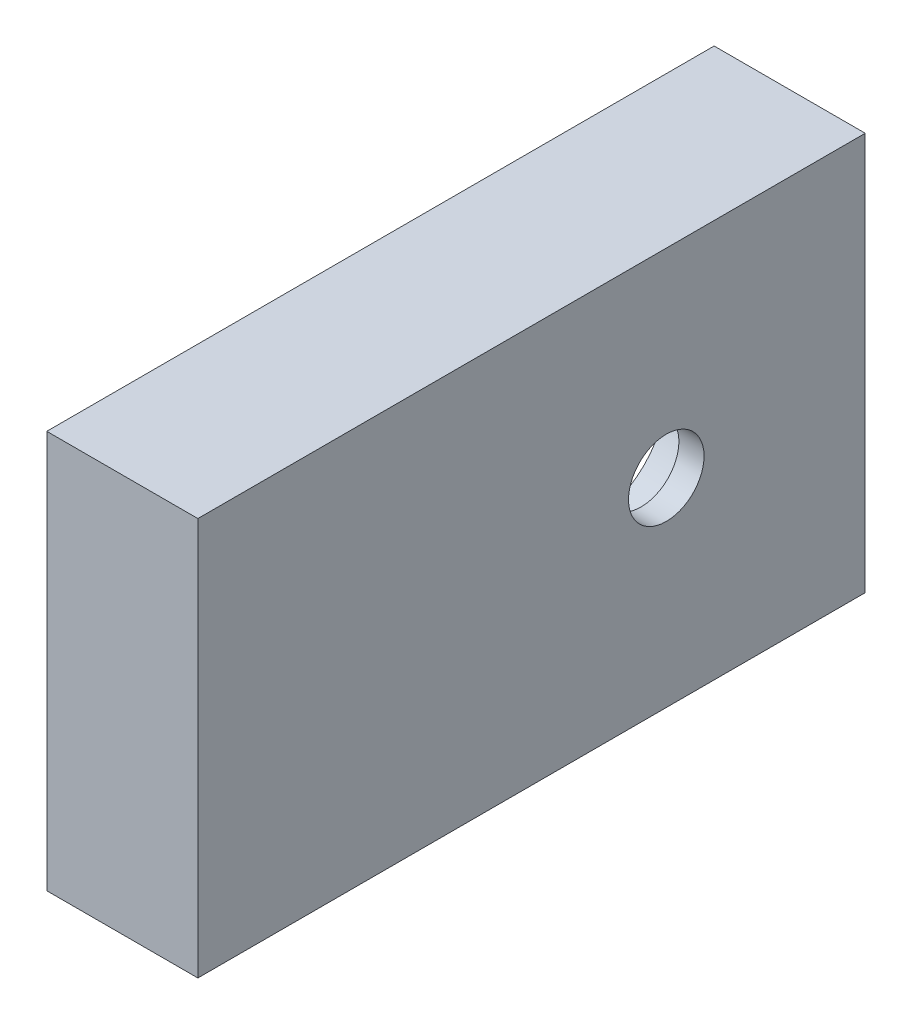
ISO-10303-21;
HEADER;
FILE_DESCRIPTION(('STEP AP214'),'2;1');
FILE_NAME('part.step','',(''),(''),'','','');
FILE_SCHEMA(('AUTOMOTIVE_DESIGN { 1 0 10303 214 1 1 1 1 }'));
ENDSEC;
DATA;
#1=APPLICATION_CONTEXT('core data for automotive mechanical design processes');
#2=APPLICATION_PROTOCOL_DEFINITION('international standard','automotive_design',2000,#1);
#3=PRODUCT_CONTEXT('',#1,'mechanical');
#4=PRODUCT('Part','Part','',(#3));
#5=PRODUCT_RELATED_PRODUCT_CATEGORY('part','',(#4));
#6=PRODUCT_DEFINITION_FORMATION('','',#4);
#7=PRODUCT_DEFINITION_CONTEXT('part definition',#1,'design');
#8=PRODUCT_DEFINITION('design','',#6,#7);
#9=PRODUCT_DEFINITION_SHAPE('','',#8);
#10=(LENGTH_UNIT() NAMED_UNIT(*) SI_UNIT(.MILLI.,.METRE.));
#11=(NAMED_UNIT(*) PLANE_ANGLE_UNIT() SI_UNIT($,.RADIAN.));
#12=(NAMED_UNIT(*) SI_UNIT($,.STERADIAN.) SOLID_ANGLE_UNIT());
#13=UNCERTAINTY_MEASURE_WITH_UNIT(LENGTH_MEASURE(1.E-05),#10,'distance_accuracy_value','');
#14=(GEOMETRIC_REPRESENTATION_CONTEXT(3) GLOBAL_UNCERTAINTY_ASSIGNED_CONTEXT((#13)) GLOBAL_UNIT_ASSIGNED_CONTEXT((#10,
#11,#12)) REPRESENTATION_CONTEXT('',''));
#15=CARTESIAN_POINT('',(0.,0.,0.));
#16=DIRECTION('',(0.,0.,1.));
#17=DIRECTION('',(1.,0.,0.));
#18=AXIS2_PLACEMENT_3D('',#15,#16,#17);
#19=CARTESIAN_POINT('',(6.,0.,0.));
#20=DIRECTION('',(-1.,0.,0.));
#21=DIRECTION('',(0.,0.,1.));
#22=AXIS2_PLACEMENT_3D('',#19,#20,#21);
#23=CYLINDRICAL_SURFACE('',#22,1.5);
#24=CARTESIAN_POINT('',(6.,0.,0.));
#25=DIRECTION('',(1.,0.,0.));
#26=DIRECTION('',(0.,0.,-1.));
#27=AXIS2_PLACEMENT_3D('',#24,#25,#26);
#28=CIRCLE('',#27,1.5);
#29=CARTESIAN_POINT('',(6.,0.,-1.5));
#30=VERTEX_POINT('',#29);
#31=EDGE_CURVE('E232',#30,#30,#28,.T.);
#32=ORIENTED_EDGE('',*,*,#31,.T.);
#33=EDGE_LOOP('',(#32));
#34=FACE_BOUND('',#33,.T.);
#35=CARTESIAN_POINT('',(5.,0.,0.));
#36=DIRECTION('',(-1.,0.,0.));
#37=DIRECTION('',(0.,0.,1.));
#38=AXIS2_PLACEMENT_3D('',#35,#36,#37);
#39=CIRCLE('',#38,1.5);
#40=CARTESIAN_POINT('',(5.,0.,1.5));
#41=VERTEX_POINT('',#40);
#42=EDGE_CURVE('E43',#41,#41,#39,.T.);
#43=ORIENTED_EDGE('',*,*,#42,.T.);
#44=EDGE_LOOP('',(#43));
#45=FACE_BOUND('',#44,.T.);
#46=ADVANCED_FACE('F39',(#34,#45),#23,.F.);
#47=CARTESIAN_POINT('',(3.,7.90000000000029,0.));
#48=DIRECTION('',(0.,1.,0.));
#49=DIRECTION('',(0.,0.,1.));
#50=AXIS2_PLACEMENT_3D('',#47,#48,#49);
#51=PLANE('',#50);
#52=DIRECTION('',(0.,0.,-1.));
#53=VECTOR('',#52,1.);
#54=CARTESIAN_POINT('',(0.,7.90000000000029,0.));
#55=LINE('',#54,#53);
#56=CARTESIAN_POINT('',(0.,7.90000000000029,18.5999999999999));
#57=VERTEX_POINT('',#56);
#58=CARTESIAN_POINT('',(0.,7.90000000000029,-7.89999999999991));
#59=VERTEX_POINT('',#58);
#60=EDGE_CURVE('E115',#57,#59,#55,.T.);
#61=ORIENTED_EDGE('',*,*,#60,.F.);
#62=DIRECTION('',(-1.,0.,0.));
#63=VECTOR('',#62,1.);
#64=CARTESIAN_POINT('',(3.,7.90000000000029,18.5999999999999));
#65=LINE('',#64,#63);
#66=CARTESIAN_POINT('',(6.,7.90000000000029,18.5999999999999));
#67=VERTEX_POINT('',#66);
#68=EDGE_CURVE('E11',#67,#57,#65,.T.);
#69=ORIENTED_EDGE('',*,*,#68,.F.);
#70=DIRECTION('',(0.,0.,1.));
#71=VECTOR('',#70,1.);
#72=CARTESIAN_POINT('',(6.,7.90000000000029,18.5999999999999));
#73=LINE('',#72,#71);
#74=CARTESIAN_POINT('',(6.,7.90000000000029,-7.89999999999991));
#75=VERTEX_POINT('',#74);
#76=EDGE_CURVE('E150',#75,#67,#73,.T.);
#77=ORIENTED_EDGE('',*,*,#76,.F.);
#78=DIRECTION('',(-1.,0.,0.));
#79=VECTOR('',#78,1.);
#80=CARTESIAN_POINT('',(3.,7.90000000000029,-7.89999999999991));
#81=LINE('',#80,#79);
#82=EDGE_CURVE('E98',#75,#59,#81,.T.);
#83=ORIENTED_EDGE('',*,*,#82,.T.);
#84=EDGE_LOOP('',(#61,#69,#77,#83));
#85=FACE_BOUND('',#84,.T.);
#86=ADVANCED_FACE('F164',(#85),#51,.T.);
#87=CARTESIAN_POINT('',(3.,0.,18.5999999999999));
#88=DIRECTION('',(0.,0.,-1.));
#89=DIRECTION('',(-1.,0.,0.));
#90=AXIS2_PLACEMENT_3D('',#87,#88,#89);
#91=PLANE('',#90);
#92=DIRECTION('',(0.,-1.,0.));
#93=VECTOR('',#92,1.);
#94=CARTESIAN_POINT('',(0.,0.,18.5999999999999));
#95=LINE('',#94,#93);
#96=CARTESIAN_POINT('',(0.,-7.90000000000011,18.5999999999999));
#97=VERTEX_POINT('',#96);
#98=EDGE_CURVE('E110',#57,#97,#95,.T.);
#99=ORIENTED_EDGE('',*,*,#98,.T.);
#100=DIRECTION('',(-1.,0.,0.));
#101=VECTOR('',#100,1.);
#102=CARTESIAN_POINT('',(3.,-7.90000000000011,18.5999999999999));
#103=LINE('',#102,#101);
#104=CARTESIAN_POINT('',(6.,-7.90000000000011,18.5999999999999));
#105=VERTEX_POINT('',#104);
#106=EDGE_CURVE('E47',#105,#97,#103,.T.);
#107=ORIENTED_EDGE('',*,*,#106,.F.);
#108=DIRECTION('',(0.,-1.,0.));
#109=VECTOR('',#108,1.);
#110=CARTESIAN_POINT('',(6.,7.90000000000029,18.5999999999999));
#111=LINE('',#110,#109);
#112=EDGE_CURVE('E179',#67,#105,#111,.T.);
#113=ORIENTED_EDGE('',*,*,#112,.F.);
#114=ORIENTED_EDGE('',*,*,#68,.T.);
#115=EDGE_LOOP('',(#99,#107,#113,#114));
#116=FACE_BOUND('',#115,.T.);
#117=ADVANCED_FACE('F159',(#116),#91,.F.);
#118=CARTESIAN_POINT('',(3.,-7.90000000000011,0.));
#119=DIRECTION('',(0.,1.,0.));
#120=DIRECTION('',(0.,0.,1.));
#121=AXIS2_PLACEMENT_3D('',#118,#119,#120);
#122=PLANE('',#121);
#123=DIRECTION('',(0.,0.,-1.));
#124=VECTOR('',#123,1.);
#125=CARTESIAN_POINT('',(0.,-7.90000000000011,0.));
#126=LINE('',#125,#124);
#127=CARTESIAN_POINT('',(0.,-7.90000000000011,-7.89999999999991));
#128=VERTEX_POINT('',#127);
#129=EDGE_CURVE('E101',#97,#128,#126,.T.);
#130=ORIENTED_EDGE('',*,*,#129,.T.);
#131=DIRECTION('',(-1.,0.,0.));
#132=VECTOR('',#131,1.);
#133=CARTESIAN_POINT('',(3.,-7.90000000000011,-7.89999999999991));
#134=LINE('',#133,#132);
#135=CARTESIAN_POINT('',(6.,-7.90000000000011,-7.89999999999991));
#136=VERTEX_POINT('',#135);
#137=EDGE_CURVE('E88',#136,#128,#134,.T.);
#138=ORIENTED_EDGE('',*,*,#137,.F.);
#139=DIRECTION('',(0.,0.,-1.));
#140=VECTOR('',#139,1.);
#141=CARTESIAN_POINT('',(6.,-7.90000000000011,18.5999999999999));
#142=LINE('',#141,#140);
#143=EDGE_CURVE('E171',#105,#136,#142,.T.);
#144=ORIENTED_EDGE('',*,*,#143,.F.);
#145=ORIENTED_EDGE('',*,*,#106,.T.);
#146=EDGE_LOOP('',(#130,#138,#144,#145));
#147=FACE_BOUND('',#146,.T.);
#148=ADVANCED_FACE('F105',(#147),#122,.F.);
#149=CARTESIAN_POINT('',(3.,5.90000000000029,0.));
#150=DIRECTION('',(0.,1.,0.));
#151=DIRECTION('',(0.,0.,1.));
#152=AXIS2_PLACEMENT_3D('',#149,#150,#151);
#153=PLANE('',#152);
#154=DIRECTION('',(0.,0.,-1.));
#155=VECTOR('',#154,1.);
#156=CARTESIAN_POINT('',(0.,5.90000000000029,0.));
#157=LINE('',#156,#155);
#158=CARTESIAN_POINT('',(0.,5.90000000000029,16.5999999999999));
#159=VERTEX_POINT('',#158);
#160=CARTESIAN_POINT('',(0.,5.90000000000029,-5.89999999999991));
#161=VERTEX_POINT('',#160);
#162=EDGE_CURVE('E142',#159,#161,#157,.T.);
#163=ORIENTED_EDGE('',*,*,#162,.T.);
#164=DIRECTION('',(-1.,0.,0.));
#165=VECTOR('',#164,1.);
#166=CARTESIAN_POINT('',(3.,5.90000000000029,-5.89999999999991));
#167=LINE('',#166,#165);
#168=CARTESIAN_POINT('',(3.,5.90000000000029,-5.89999999999991));
#169=VERTEX_POINT('',#168);
#170=EDGE_CURVE('E118',#169,#161,#167,.T.);
#171=ORIENTED_EDGE('',*,*,#170,.F.);
#172=DIRECTION('',(0.,0.,-1.));
#173=VECTOR('',#172,1.);
#174=CARTESIAN_POINT('',(3.,5.90000000000029,0.));
#175=LINE('',#174,#173);
#176=CARTESIAN_POINT('',(3.,5.90000000000029,16.5999999999999));
#177=VERTEX_POINT('',#176);
#178=EDGE_CURVE('E114',#177,#169,#175,.T.);
#179=ORIENTED_EDGE('',*,*,#178,.F.);
#180=DIRECTION('',(-1.,0.,0.));
#181=VECTOR('',#180,1.);
#182=CARTESIAN_POINT('',(3.,5.90000000000029,16.5999999999999));
#183=LINE('',#182,#181);
#184=EDGE_CURVE('E125',#177,#159,#183,.T.);
#185=ORIENTED_EDGE('',*,*,#184,.T.);
#186=EDGE_LOOP('',(#163,#171,#179,#185));
#187=FACE_BOUND('',#186,.T.);
#188=ADVANCED_FACE('F41',(#187),#153,.F.);
#189=CARTESIAN_POINT('',(3.,0.,-5.89999999999991));
#190=DIRECTION('',(0.,0.,-1.));
#191=DIRECTION('',(-1.,0.,0.));
#192=AXIS2_PLACEMENT_3D('',#189,#190,#191);
#193=PLANE('',#192);
#194=DIRECTION('',(0.,-1.,0.));
#195=VECTOR('',#194,1.);
#196=CARTESIAN_POINT('',(0.,0.,-5.89999999999991));
#197=LINE('',#196,#195);
#198=CARTESIAN_POINT('',(0.,-5.90000000000011,-5.89999999999991));
#199=VERTEX_POINT('',#198);
#200=EDGE_CURVE('E136',#161,#199,#197,.T.);
#201=ORIENTED_EDGE('',*,*,#200,.T.);
#202=DIRECTION('',(-1.,0.,0.));
#203=VECTOR('',#202,1.);
#204=CARTESIAN_POINT('',(3.,-5.90000000000011,-5.89999999999991));
#205=LINE('',#204,#203);
#206=CARTESIAN_POINT('',(3.,-5.90000000000011,-5.89999999999991));
#207=VERTEX_POINT('',#206);
#208=EDGE_CURVE('E126',#207,#199,#205,.T.);
#209=ORIENTED_EDGE('',*,*,#208,.F.);
#210=DIRECTION('',(0.,-1.,0.));
#211=VECTOR('',#210,1.);
#212=CARTESIAN_POINT('',(3.,0.,-5.89999999999991));
#213=LINE('',#212,#211);
#214=EDGE_CURVE('E117',#169,#207,#213,.T.);
#215=ORIENTED_EDGE('',*,*,#214,.F.);
#216=ORIENTED_EDGE('',*,*,#170,.T.);
#217=EDGE_LOOP('',(#201,#209,#215,#216));
#218=FACE_BOUND('',#217,.T.);
#219=ADVANCED_FACE('F133',(#218),#193,.F.);
#220=CARTESIAN_POINT('',(3.,-5.90000000000011,0.));
#221=DIRECTION('',(0.,1.,0.));
#222=DIRECTION('',(0.,0.,1.));
#223=AXIS2_PLACEMENT_3D('',#220,#221,#222);
#224=PLANE('',#223);
#225=DIRECTION('',(0.,0.,-1.));
#226=VECTOR('',#225,1.);
#227=CARTESIAN_POINT('',(0.,-5.90000000000011,0.));
#228=LINE('',#227,#226);
#229=CARTESIAN_POINT('',(0.,-5.90000000000011,16.5999999999999));
#230=VERTEX_POINT('',#229);
#231=EDGE_CURVE('E149',#230,#199,#228,.T.);
#232=ORIENTED_EDGE('',*,*,#231,.F.);
#233=DIRECTION('',(-1.,0.,0.));
#234=VECTOR('',#233,1.);
#235=CARTESIAN_POINT('',(3.,-5.90000000000011,16.5999999999999));
#236=LINE('',#235,#234);
#237=CARTESIAN_POINT('',(3.,-5.90000000000011,16.5999999999999));
#238=VERTEX_POINT('',#237);
#239=EDGE_CURVE('E122',#238,#230,#236,.T.);
#240=ORIENTED_EDGE('',*,*,#239,.F.);
#241=DIRECTION('',(0.,0.,-1.));
#242=VECTOR('',#241,1.);
#243=CARTESIAN_POINT('',(3.,-5.90000000000011,0.));
#244=LINE('',#243,#242);
#245=EDGE_CURVE('E60',#238,#207,#244,.T.);
#246=ORIENTED_EDGE('',*,*,#245,.T.);
#247=ORIENTED_EDGE('',*,*,#208,.T.);
#248=EDGE_LOOP('',(#232,#240,#246,#247));
#249=FACE_BOUND('',#248,.T.);
#250=ADVANCED_FACE('F191',(#249),#224,.T.);
#251=CARTESIAN_POINT('',(3.,0.,16.5999999999999));
#252=DIRECTION('',(0.,0.,-1.));
#253=DIRECTION('',(-1.,0.,0.));
#254=AXIS2_PLACEMENT_3D('',#251,#252,#253);
#255=PLANE('',#254);
#256=DIRECTION('',(0.,-1.,0.));
#257=VECTOR('',#256,1.);
#258=CARTESIAN_POINT('',(0.,0.,16.5999999999999));
#259=LINE('',#258,#257);
#260=EDGE_CURVE('E160',#159,#230,#259,.T.);
#261=ORIENTED_EDGE('',*,*,#260,.F.);
#262=ORIENTED_EDGE('',*,*,#184,.F.);
#263=DIRECTION('',(0.,-1.,0.));
#264=VECTOR('',#263,1.);
#265=CARTESIAN_POINT('',(3.,0.,16.5999999999999));
#266=LINE('',#265,#264);
#267=EDGE_CURVE('E127',#177,#238,#266,.T.);
#268=ORIENTED_EDGE('',*,*,#267,.T.);
#269=ORIENTED_EDGE('',*,*,#239,.T.);
#270=EDGE_LOOP('',(#261,#262,#268,#269));
#271=FACE_BOUND('',#270,.T.);
#272=ADVANCED_FACE('F184',(#271),#255,.T.);
#273=CARTESIAN_POINT('',(3.,0.,-7.89999999999991));
#274=DIRECTION('',(0.,0.,-1.));
#275=DIRECTION('',(0.,1.,0.));
#276=AXIS2_PLACEMENT_3D('',#273,#274,#275);
#277=PLANE('',#276);
#278=DIRECTION('',(0.,-1.,0.));
#279=VECTOR('',#278,1.);
#280=CARTESIAN_POINT('',(0.,0.,-7.89999999999991));
#281=LINE('',#280,#279);
#282=EDGE_CURVE('E93',#59,#128,#281,.T.);
#283=ORIENTED_EDGE('',*,*,#282,.F.);
#284=ORIENTED_EDGE('',*,*,#82,.F.);
#285=DIRECTION('',(0.,1.,0.));
#286=VECTOR('',#285,1.);
#287=CARTESIAN_POINT('',(6.,7.90000000000029,-7.89999999999991));
#288=LINE('',#287,#286);
#289=EDGE_CURVE('E94',#136,#75,#288,.T.);
#290=ORIENTED_EDGE('',*,*,#289,.F.);
#291=ORIENTED_EDGE('',*,*,#137,.T.);
#292=EDGE_LOOP('',(#283,#284,#290,#291));
#293=FACE_BOUND('',#292,.T.);
#294=ADVANCED_FACE('F86',(#293),#277,.T.);
#295=CARTESIAN_POINT('',(0.,0.,0.));
#296=DIRECTION('',(1.,0.,0.));
#297=DIRECTION('',(0.,0.,-1.));
#298=AXIS2_PLACEMENT_3D('',#295,#296,#297);
#299=PLANE('',#298);
#300=ORIENTED_EDGE('',*,*,#162,.F.);
#301=ORIENTED_EDGE('',*,*,#260,.T.);
#302=ORIENTED_EDGE('',*,*,#231,.T.);
#303=ORIENTED_EDGE('',*,*,#200,.F.);
#304=EDGE_LOOP('',(#300,#301,#302,#303));
#305=FACE_BOUND('',#304,.T.);
#306=ORIENTED_EDGE('',*,*,#60,.T.);
#307=ORIENTED_EDGE('',*,*,#282,.T.);
#308=ORIENTED_EDGE('',*,*,#129,.F.);
#309=ORIENTED_EDGE('',*,*,#98,.F.);
#310=EDGE_LOOP('',(#306,#307,#308,#309));
#311=FACE_BOUND('',#310,.T.);
#312=ADVANCED_FACE('F109',(#305,#311),#299,.F.);
#313=CARTESIAN_POINT('',(3.,0.,0.));
#314=DIRECTION('',(1.,0.,0.));
#315=DIRECTION('',(0.,0.,-1.));
#316=AXIS2_PLACEMENT_3D('',#313,#314,#315);
#317=PLANE('',#316);
#318=CARTESIAN_POINT('',(3.,0.,0.));
#319=DIRECTION('',(-1.,0.,0.));
#320=DIRECTION('',(0.,0.,1.));
#321=AXIS2_PLACEMENT_3D('',#318,#319,#320);
#322=CIRCLE('',#321,3.);
#323=CARTESIAN_POINT('',(3.,0.,3.));
#324=VERTEX_POINT('',#323);
#325=EDGE_CURVE('E234',#324,#324,#322,.T.);
#326=ORIENTED_EDGE('',*,*,#325,.F.);
#327=EDGE_LOOP('',(#326));
#328=FACE_BOUND('',#327,.T.);
#329=ORIENTED_EDGE('',*,*,#267,.F.);
#330=ORIENTED_EDGE('',*,*,#178,.T.);
#331=ORIENTED_EDGE('',*,*,#214,.T.);
#332=ORIENTED_EDGE('',*,*,#245,.F.);
#333=EDGE_LOOP('',(#329,#330,#331,#332));
#334=FACE_BOUND('',#333,.T.);
#335=ADVANCED_FACE('F190',(#328,#334),#317,.F.);
#336=CARTESIAN_POINT('',(6.,0.,0.));
#337=DIRECTION('',(1.,0.,0.));
#338=DIRECTION('',(0.,0.,-1.));
#339=AXIS2_PLACEMENT_3D('',#336,#337,#338);
#340=PLANE('',#339);
#341=ORIENTED_EDGE('',*,*,#112,.T.);
#342=ORIENTED_EDGE('',*,*,#143,.T.);
#343=ORIENTED_EDGE('',*,*,#289,.T.);
#344=ORIENTED_EDGE('',*,*,#76,.T.);
#345=EDGE_LOOP('',(#341,#342,#343,#344));
#346=FACE_BOUND('',#345,.T.);
#347=ORIENTED_EDGE('',*,*,#31,.F.);
#348=EDGE_LOOP('',(#347));
#349=FACE_BOUND('',#348,.T.);
#350=ADVANCED_FACE('F175',(#346,#349),#340,.T.);
#351=CARTESIAN_POINT('',(5.,0.,0.));
#352=DIRECTION('',(-1.,0.,0.));
#353=DIRECTION('',(0.,0.,1.));
#354=AXIS2_PLACEMENT_3D('',#351,#352,#353);
#355=CYLINDRICAL_SURFACE('',#354,3.);
#356=CARTESIAN_POINT('',(5.,0.,0.));
#357=DIRECTION('',(-1.,0.,0.));
#358=DIRECTION('',(0.,0.,1.));
#359=AXIS2_PLACEMENT_3D('',#356,#357,#358);
#360=CIRCLE('',#359,3.);
#361=CARTESIAN_POINT('',(5.,0.,3.));
#362=VERTEX_POINT('',#361);
#363=EDGE_CURVE('E229',#362,#362,#360,.T.);
#364=ORIENTED_EDGE('',*,*,#363,.F.);
#365=EDGE_LOOP('',(#364));
#366=FACE_BOUND('',#365,.T.);
#367=ORIENTED_EDGE('',*,*,#325,.T.);
#368=EDGE_LOOP('',(#367));
#369=FACE_BOUND('',#368,.T.);
#370=ADVANCED_FACE('F212',(#366,#369),#355,.F.);
#371=CARTESIAN_POINT('',(5.,0.,0.));
#372=DIRECTION('',(-1.,0.,0.));
#373=DIRECTION('',(0.,0.,1.));
#374=AXIS2_PLACEMENT_3D('',#371,#372,#373);
#375=PLANE('',#374);
#376=ORIENTED_EDGE('',*,*,#42,.F.);
#377=EDGE_LOOP('',(#376));
#378=FACE_BOUND('',#377,.T.);
#379=ORIENTED_EDGE('',*,*,#363,.T.);
#380=EDGE_LOOP('',(#379));
#381=FACE_BOUND('',#380,.T.);
#382=ADVANCED_FACE('F218',(#378,#381),#375,.T.);
#383=CLOSED_SHELL('',(#46,#86,#117,#148,#188,#219,#250,#272,#294,#312,#335,#350,#370,#382));
#384=MANIFOLD_SOLID_BREP('B2',#383);
#385=ADVANCED_BREP_SHAPE_REPRESENTATION('',(#18,#384),#14);
#386=SHAPE_DEFINITION_REPRESENTATION(#9,#385);
ENDSEC;
END-ISO-10303-21;
